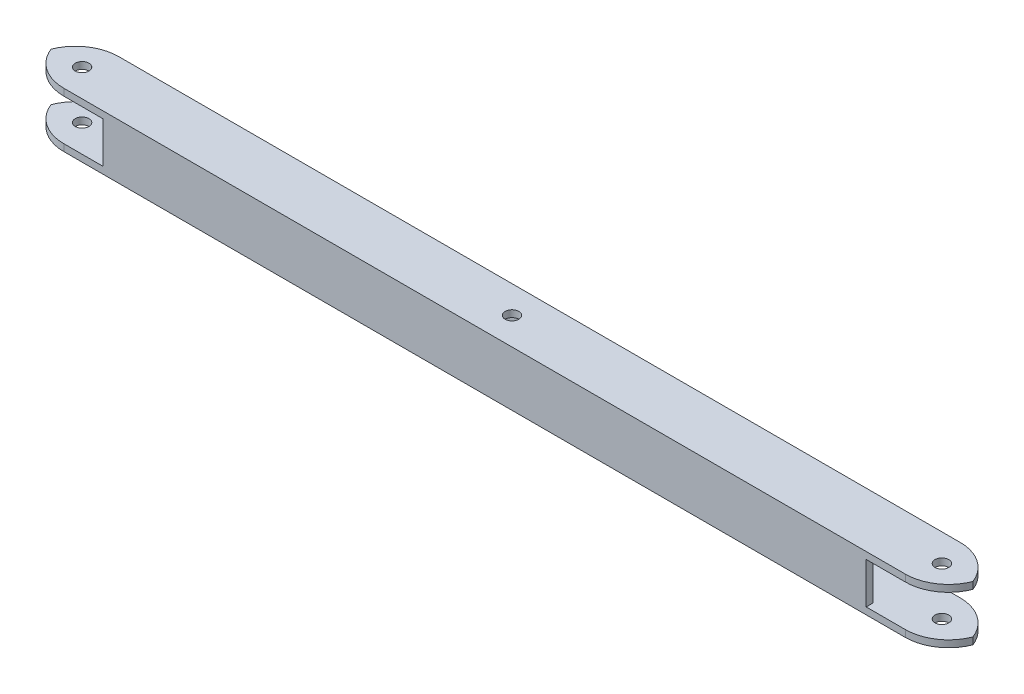
ISO-10303-21;
HEADER;
FILE_DESCRIPTION(('STEP AP214'),'2;1');
FILE_NAME('part.step','',(''),(''),'','','');
FILE_SCHEMA(('AUTOMOTIVE_DESIGN { 1 0 10303 214 1 1 1 1 }'));
ENDSEC;
DATA;
#1=APPLICATION_CONTEXT('core data for automotive mechanical design processes');
#2=APPLICATION_PROTOCOL_DEFINITION('international standard','automotive_design',2000,#1);
#3=PRODUCT_CONTEXT('',#1,'mechanical');
#4=PRODUCT('Part','Part','',(#3));
#5=PRODUCT_RELATED_PRODUCT_CATEGORY('part','',(#4));
#6=PRODUCT_DEFINITION_FORMATION('','',#4);
#7=PRODUCT_DEFINITION_CONTEXT('part definition',#1,'design');
#8=PRODUCT_DEFINITION('design','',#6,#7);
#9=PRODUCT_DEFINITION_SHAPE('','',#8);
#10=(LENGTH_UNIT() NAMED_UNIT(*) SI_UNIT(.MILLI.,.METRE.));
#11=(NAMED_UNIT(*) PLANE_ANGLE_UNIT() SI_UNIT($,.RADIAN.));
#12=(NAMED_UNIT(*) SI_UNIT($,.STERADIAN.) SOLID_ANGLE_UNIT());
#13=UNCERTAINTY_MEASURE_WITH_UNIT(LENGTH_MEASURE(1.E-05),#10,'distance_accuracy_value','');
#14=(GEOMETRIC_REPRESENTATION_CONTEXT(3) GLOBAL_UNCERTAINTY_ASSIGNED_CONTEXT((#13)) GLOBAL_UNIT_ASSIGNED_CONTEXT((#10,
#11,#12)) REPRESENTATION_CONTEXT('',''));
#15=CARTESIAN_POINT('',(0.,0.,0.));
#16=DIRECTION('',(0.,0.,1.));
#17=DIRECTION('',(1.,0.,0.));
#18=AXIS2_PLACEMENT_3D('',#15,#16,#17);
#19=CARTESIAN_POINT('',(429.48,25.4,25.4000000000002));
#20=DIRECTION('',(0.,0.,-1.));
#21=DIRECTION('',(-1.,0.,0.));
#22=AXIS2_PLACEMENT_3D('',#19,#20,#21);
#23=PLANE('',#22);
#24=DIRECTION('',(1.,0.,0.));
#25=VECTOR('',#24,1.);
#26=CARTESIAN_POINT('',(429.48,0.,25.4000000000002));
#27=LINE('',#26,#25);
#28=CARTESIAN_POINT('',(20.,0.,25.4000000000003));
#29=VERTEX_POINT('',#28);
#30=CARTESIAN_POINT('',(409.48,0.,25.4000000000002));
#31=VERTEX_POINT('',#30);
#32=EDGE_CURVE('E284',#29,#31,#27,.T.);
#33=ORIENTED_EDGE('',*,*,#32,.T.);
#34=DIRECTION('',(0.,-1.,0.));
#35=VECTOR('',#34,1.);
#36=CARTESIAN_POINT('',(409.48,25.4,25.4000000000002));
#37=LINE('',#36,#35);
#38=CARTESIAN_POINT('',(409.48,3.175,25.4000000000003));
#39=VERTEX_POINT('',#38);
#40=EDGE_CURVE('E11',#31,#39,#37,.F.);
#41=ORIENTED_EDGE('',*,*,#40,.T.);
#42=DIRECTION('',(1.,0.,0.));
#43=VECTOR('',#42,1.);
#44=CARTESIAN_POINT('',(391.38,3.175,25.4000000000003));
#45=LINE('',#44,#43);
#46=CARTESIAN_POINT('',(391.38,3.175,25.4000000000003));
#47=VERTEX_POINT('',#46);
#48=EDGE_CURVE('E188',#47,#39,#45,.T.);
#49=ORIENTED_EDGE('',*,*,#48,.F.);
#50=DIRECTION('',(0.,1.,0.));
#51=VECTOR('',#50,1.);
#52=CARTESIAN_POINT('',(391.38,22.225,25.4000000000003));
#53=LINE('',#52,#51);
#54=CARTESIAN_POINT('',(391.38,22.225,25.4000000000003));
#55=VERTEX_POINT('',#54);
#56=EDGE_CURVE('E194',#47,#55,#53,.T.);
#57=ORIENTED_EDGE('',*,*,#56,.T.);
#58=DIRECTION('',(1.,0.,0.));
#59=VECTOR('',#58,1.);
#60=CARTESIAN_POINT('',(391.38,22.225,25.4000000000003));
#61=LINE('',#60,#59);
#62=CARTESIAN_POINT('',(409.48,22.225,25.4000000000003));
#63=VERTEX_POINT('',#62);
#64=EDGE_CURVE('E176',#55,#63,#61,.T.);
#65=ORIENTED_EDGE('',*,*,#64,.T.);
#66=DIRECTION('',(0.,-1.,0.));
#67=VECTOR('',#66,1.);
#68=CARTESIAN_POINT('',(409.48,25.4,25.4000000000002));
#69=LINE('',#68,#67);
#70=CARTESIAN_POINT('',(409.48,25.4,25.4000000000002));
#71=VERTEX_POINT('',#70);
#72=EDGE_CURVE('E46',#63,#71,#69,.F.);
#73=ORIENTED_EDGE('',*,*,#72,.T.);
#74=DIRECTION('',(1.,0.,0.));
#75=VECTOR('',#74,1.);
#76=CARTESIAN_POINT('',(429.48,25.4,25.4000000000002));
#77=LINE('',#76,#75);
#78=CARTESIAN_POINT('',(20.,25.4,25.4000000000003));
#79=VERTEX_POINT('',#78);
#80=EDGE_CURVE('E287',#79,#71,#77,.T.);
#81=ORIENTED_EDGE('',*,*,#80,.F.);
#82=DIRECTION('',(0.,-1.,0.));
#83=VECTOR('',#82,1.);
#84=CARTESIAN_POINT('',(20.,25.4,25.4000000000003));
#85=LINE('',#84,#83);
#86=CARTESIAN_POINT('',(20.,22.225,25.4000000000003));
#87=VERTEX_POINT('',#86);
#88=EDGE_CURVE('E344',#79,#87,#85,.T.);
#89=ORIENTED_EDGE('',*,*,#88,.T.);
#90=DIRECTION('',(-1.,0.,0.));
#91=VECTOR('',#90,1.);
#92=CARTESIAN_POINT('',(38.1,22.225,25.4000000000003));
#93=LINE('',#92,#91);
#94=CARTESIAN_POINT('',(38.1,22.225,25.4000000000003));
#95=VERTEX_POINT('',#94);
#96=EDGE_CURVE('E232',#95,#87,#93,.T.);
#97=ORIENTED_EDGE('',*,*,#96,.F.);
#98=DIRECTION('',(0.,1.,0.));
#99=VECTOR('',#98,1.);
#100=CARTESIAN_POINT('',(38.1,22.225,25.4000000000003));
#101=LINE('',#100,#99);
#102=CARTESIAN_POINT('',(38.1,3.175,25.4000000000003));
#103=VERTEX_POINT('',#102);
#104=EDGE_CURVE('E228',#103,#95,#101,.T.);
#105=ORIENTED_EDGE('',*,*,#104,.F.);
#106=DIRECTION('',(-1.,0.,0.));
#107=VECTOR('',#106,1.);
#108=CARTESIAN_POINT('',(38.1,3.175,25.4000000000003));
#109=LINE('',#108,#107);
#110=CARTESIAN_POINT('',(20.,3.175,25.4000000000003));
#111=VERTEX_POINT('',#110);
#112=EDGE_CURVE('E236',#103,#111,#109,.T.);
#113=ORIENTED_EDGE('',*,*,#112,.T.);
#114=DIRECTION('',(0.,-1.,0.));
#115=VECTOR('',#114,1.);
#116=CARTESIAN_POINT('',(20.,25.4,25.4000000000003));
#117=LINE('',#116,#115);
#118=EDGE_CURVE('E347',#111,#29,#117,.T.);
#119=ORIENTED_EDGE('',*,*,#118,.T.);
#120=EDGE_LOOP('',(#33,#41,#49,#57,#65,#73,#81,#89,#97,#105,#113,#119));
#121=FACE_BOUND('',#120,.T.);
#122=ADVANCED_FACE('F37',(#121),#23,.F.);
#123=CARTESIAN_POINT('',(0.,25.4,0.));
#124=DIRECTION('',(0.,0.,1.));
#125=DIRECTION('',(1.,0.,0.));
#126=AXIS2_PLACEMENT_3D('',#123,#124,#125);
#127=PLANE('',#126);
#128=DIRECTION('',(1.,0.,0.));
#129=VECTOR('',#128,1.);
#130=CARTESIAN_POINT('',(391.38,3.175,0.));
#131=LINE('',#130,#129);
#132=CARTESIAN_POINT('',(391.38,3.175,0.));
#133=VERTEX_POINT('',#132);
#134=CARTESIAN_POINT('',(409.48,3.175,0.));
#135=VERTEX_POINT('',#134);
#136=EDGE_CURVE('E212',#133,#135,#131,.T.);
#137=ORIENTED_EDGE('',*,*,#136,.T.);
#138=DIRECTION('',(0.,-1.,0.));
#139=VECTOR('',#138,1.);
#140=CARTESIAN_POINT('',(409.48,25.4,0.));
#141=LINE('',#140,#139);
#142=CARTESIAN_POINT('',(409.48,0.,0.));
#143=VERTEX_POINT('',#142);
#144=EDGE_CURVE('E312',#135,#143,#141,.T.);
#145=ORIENTED_EDGE('',*,*,#144,.T.);
#146=DIRECTION('',(-1.,0.,0.));
#147=VECTOR('',#146,1.);
#148=CARTESIAN_POINT('',(0.,0.,0.));
#149=LINE('',#148,#147);
#150=CARTESIAN_POINT('',(20.,0.,0.));
#151=VERTEX_POINT('',#150);
#152=EDGE_CURVE('E290',#143,#151,#149,.T.);
#153=ORIENTED_EDGE('',*,*,#152,.T.);
#154=DIRECTION('',(0.,-1.,0.));
#155=VECTOR('',#154,1.);
#156=CARTESIAN_POINT('',(20.,25.4,0.));
#157=LINE('',#156,#155);
#158=CARTESIAN_POINT('',(20.,3.175,0.));
#159=VERTEX_POINT('',#158);
#160=EDGE_CURVE('E307',#151,#159,#157,.F.);
#161=ORIENTED_EDGE('',*,*,#160,.T.);
#162=DIRECTION('',(-1.,0.,0.));
#163=VECTOR('',#162,1.);
#164=CARTESIAN_POINT('',(38.1,3.175,0.));
#165=LINE('',#164,#163);
#166=CARTESIAN_POINT('',(38.1,3.175,0.));
#167=VERTEX_POINT('',#166);
#168=EDGE_CURVE('E239',#167,#159,#165,.T.);
#169=ORIENTED_EDGE('',*,*,#168,.F.);
#170=DIRECTION('',(0.,-1.,0.));
#171=VECTOR('',#170,1.);
#172=CARTESIAN_POINT('',(38.1,3.175,0.));
#173=LINE('',#172,#171);
#174=CARTESIAN_POINT('',(38.1,22.225,0.));
#175=VERTEX_POINT('',#174);
#176=EDGE_CURVE('E221',#175,#167,#173,.T.);
#177=ORIENTED_EDGE('',*,*,#176,.F.);
#178=DIRECTION('',(-1.,0.,0.));
#179=VECTOR('',#178,1.);
#180=CARTESIAN_POINT('',(38.1,22.225,0.));
#181=LINE('',#180,#179);
#182=CARTESIAN_POINT('',(20.,22.225,0.));
#183=VERTEX_POINT('',#182);
#184=EDGE_CURVE('E231',#175,#183,#181,.T.);
#185=ORIENTED_EDGE('',*,*,#184,.T.);
#186=DIRECTION('',(0.,-1.,0.));
#187=VECTOR('',#186,1.);
#188=CARTESIAN_POINT('',(20.,25.4,0.));
#189=LINE('',#188,#187);
#190=CARTESIAN_POINT('',(20.,25.4,0.));
#191=VERTEX_POINT('',#190);
#192=EDGE_CURVE('E305',#183,#191,#189,.F.);
#193=ORIENTED_EDGE('',*,*,#192,.T.);
#194=DIRECTION('',(-1.,0.,0.));
#195=VECTOR('',#194,1.);
#196=CARTESIAN_POINT('',(0.,25.4,0.));
#197=LINE('',#196,#195);
#198=CARTESIAN_POINT('',(409.48,25.4,0.));
#199=VERTEX_POINT('',#198);
#200=EDGE_CURVE('E289',#199,#191,#197,.T.);
#201=ORIENTED_EDGE('',*,*,#200,.F.);
#202=DIRECTION('',(0.,-1.,0.));
#203=VECTOR('',#202,1.);
#204=CARTESIAN_POINT('',(409.48,25.4,0.));
#205=LINE('',#204,#203);
#206=CARTESIAN_POINT('',(409.48,22.225,0.));
#207=VERTEX_POINT('',#206);
#208=EDGE_CURVE('E309',#199,#207,#205,.T.);
#209=ORIENTED_EDGE('',*,*,#208,.T.);
#210=DIRECTION('',(1.,0.,0.));
#211=VECTOR('',#210,1.);
#212=CARTESIAN_POINT('',(391.38,22.225,0.));
#213=LINE('',#212,#211);
#214=CARTESIAN_POINT('',(391.38,22.225,0.));
#215=VERTEX_POINT('',#214);
#216=EDGE_CURVE('E210',#215,#207,#213,.T.);
#217=ORIENTED_EDGE('',*,*,#216,.F.);
#218=DIRECTION('',(0.,-1.,0.));
#219=VECTOR('',#218,1.);
#220=CARTESIAN_POINT('',(391.38,3.175,0.));
#221=LINE('',#220,#219);
#222=EDGE_CURVE('E189',#215,#133,#221,.T.);
#223=ORIENTED_EDGE('',*,*,#222,.T.);
#224=EDGE_LOOP('',(#137,#145,#153,#161,#169,#177,#185,#193,#201,#209,#217,#223));
#225=FACE_BOUND('',#224,.T.);
#226=ADVANCED_FACE('F373',(#225),#127,.F.);
#227=CARTESIAN_POINT('',(214.74,25.4,12.7));
#228=DIRECTION('',(0.,-1.,0.));
#229=DIRECTION('',(0.,0.,-1.));
#230=AXIS2_PLACEMENT_3D('',#227,#228,#229);
#231=CYLINDRICAL_SURFACE('',#230,3.175);
#232=CARTESIAN_POINT('',(214.74,22.225,12.7));
#233=DIRECTION('',(0.,1.,0.));
#234=DIRECTION('',(0.,0.,1.));
#235=AXIS2_PLACEMENT_3D('',#232,#233,#234);
#236=CIRCLE('',#235,3.175);
#237=CARTESIAN_POINT('',(214.74,22.225,15.875));
#238=VERTEX_POINT('',#237);
#239=EDGE_CURVE('E265',#238,#238,#236,.T.);
#240=ORIENTED_EDGE('',*,*,#239,.F.);
#241=EDGE_LOOP('',(#240));
#242=FACE_BOUND('',#241,.T.);
#243=CARTESIAN_POINT('',(214.74,25.4,12.7));
#244=DIRECTION('',(0.,1.,0.));
#245=DIRECTION('',(0.,0.,1.));
#246=AXIS2_PLACEMENT_3D('',#243,#244,#245);
#247=CIRCLE('',#246,3.175);
#248=CARTESIAN_POINT('',(214.74,25.4,15.875));
#249=VERTEX_POINT('',#248);
#250=EDGE_CURVE('E281',#249,#249,#247,.T.);
#251=ORIENTED_EDGE('',*,*,#250,.T.);
#252=EDGE_LOOP('',(#251));
#253=FACE_BOUND('',#252,.T.);
#254=ADVANCED_FACE('F442',(#242,#253),#231,.F.);
#255=CARTESIAN_POINT('',(413.72,25.4,12.7));
#256=DIRECTION('',(0.,-1.,0.));
#257=DIRECTION('',(0.,0.,-1.));
#258=AXIS2_PLACEMENT_3D('',#255,#256,#257);
#259=CYLINDRICAL_SURFACE('',#258,3.17500000000009);
#260=CARTESIAN_POINT('',(413.72,22.225,12.7));
#261=DIRECTION('',(0.,1.,0.));
#262=DIRECTION('',(0.,0.,1.));
#263=AXIS2_PLACEMENT_3D('',#260,#261,#262);
#264=CIRCLE('',#263,3.17500000000009);
#265=CARTESIAN_POINT('',(413.72,22.225,15.8750000000001));
#266=VERTEX_POINT('',#265);
#267=EDGE_CURVE('E262',#266,#266,#264,.T.);
#268=ORIENTED_EDGE('',*,*,#267,.F.);
#269=EDGE_LOOP('',(#268));
#270=FACE_BOUND('',#269,.T.);
#271=CARTESIAN_POINT('',(413.72,25.4,12.7));
#272=DIRECTION('',(0.,1.,0.));
#273=DIRECTION('',(0.,0.,-1.));
#274=AXIS2_PLACEMENT_3D('',#271,#272,#273);
#275=CIRCLE('',#274,3.17500000000009);
#276=CARTESIAN_POINT('',(413.72,25.4,9.52499999999993));
#277=VERTEX_POINT('',#276);
#278=EDGE_CURVE('E275',#277,#277,#275,.T.);
#279=ORIENTED_EDGE('',*,*,#278,.T.);
#280=EDGE_LOOP('',(#279));
#281=FACE_BOUND('',#280,.T.);
#282=ADVANCED_FACE('F478',(#270,#281),#259,.F.);
#283=CARTESIAN_POINT('',(15.76,25.4,12.7000000000001));
#284=DIRECTION('',(0.,-1.,0.));
#285=DIRECTION('',(0.,0.,-1.));
#286=AXIS2_PLACEMENT_3D('',#283,#284,#285);
#287=CYLINDRICAL_SURFACE('',#286,3.17500000000001);
#288=CARTESIAN_POINT('',(15.76,22.225,12.7000000000001));
#289=DIRECTION('',(0.,1.,0.));
#290=DIRECTION('',(0.,0.,1.));
#291=AXIS2_PLACEMENT_3D('',#288,#289,#290);
#292=CIRCLE('',#291,3.17500000000001);
#293=CARTESIAN_POINT('',(15.76,22.225,15.8750000000001));
#294=VERTEX_POINT('',#293);
#295=EDGE_CURVE('E261',#294,#294,#292,.T.);
#296=ORIENTED_EDGE('',*,*,#295,.F.);
#297=EDGE_LOOP('',(#296));
#298=FACE_BOUND('',#297,.T.);
#299=CARTESIAN_POINT('',(15.76,25.4,12.7000000000001));
#300=DIRECTION('',(0.,1.,0.));
#301=DIRECTION('',(0.,0.,1.));
#302=AXIS2_PLACEMENT_3D('',#299,#300,#301);
#303=CIRCLE('',#302,3.17500000000001);
#304=CARTESIAN_POINT('',(15.76,25.4,15.8750000000001));
#305=VERTEX_POINT('',#304);
#306=EDGE_CURVE('E269',#305,#305,#303,.T.);
#307=ORIENTED_EDGE('',*,*,#306,.T.);
#308=EDGE_LOOP('',(#307));
#309=FACE_BOUND('',#308,.T.);
#310=ADVANCED_FACE('F473',(#298,#309),#287,.F.);
#311=CARTESIAN_POINT('',(0.,25.4,0.));
#312=DIRECTION('',(0.,-1.,0.));
#313=DIRECTION('',(0.,0.,-1.));
#314=AXIS2_PLACEMENT_3D('',#311,#312,#313);
#315=PLANE('',#314);
#316=CARTESIAN_POINT('',(409.48,25.4,5.40000000000018));
#317=DIRECTION('',(0.,-1.,0.));
#318=DIRECTION('',(0.,0.,-1.));
#319=AXIS2_PLACEMENT_3D('',#316,#317,#318);
#320=CIRCLE('',#319,20.);
#321=CARTESIAN_POINT('',(428.100150375333,25.4,12.7000000000001));
#322=VERTEX_POINT('',#321);
#323=EDGE_CURVE('E54',#71,#322,#320,.F.);
#324=ORIENTED_EDGE('',*,*,#323,.T.);
#325=CARTESIAN_POINT('',(409.48,25.4,20.));
#326=DIRECTION('',(0.,-1.,0.));
#327=DIRECTION('',(0.,0.,-1.));
#328=AXIS2_PLACEMENT_3D('',#325,#326,#327);
#329=CIRCLE('',#328,20.);
#330=EDGE_CURVE('E342',#322,#199,#329,.F.);
#331=ORIENTED_EDGE('',*,*,#330,.T.);
#332=ORIENTED_EDGE('',*,*,#200,.T.);
#333=CARTESIAN_POINT('',(20.,25.4,20.));
#334=DIRECTION('',(0.,-1.,0.));
#335=DIRECTION('',(0.,0.,-1.));
#336=AXIS2_PLACEMENT_3D('',#333,#334,#335);
#337=CIRCLE('',#336,20.);
#338=CARTESIAN_POINT('',(1.37984962466732,25.4,12.7000000000001));
#339=VERTEX_POINT('',#338);
#340=EDGE_CURVE('E61',#191,#339,#337,.F.);
#341=ORIENTED_EDGE('',*,*,#340,.T.);
#342=CARTESIAN_POINT('',(20.,25.4,5.40000000000028));
#343=DIRECTION('',(0.,-1.,0.));
#344=DIRECTION('',(0.,0.,-1.));
#345=AXIS2_PLACEMENT_3D('',#342,#343,#344);
#346=CIRCLE('',#345,20.);
#347=EDGE_CURVE('E339',#339,#79,#346,.F.);
#348=ORIENTED_EDGE('',*,*,#347,.T.);
#349=ORIENTED_EDGE('',*,*,#80,.T.);
#350=EDGE_LOOP('',(#324,#331,#332,#341,#348,#349));
#351=FACE_BOUND('',#350,.T.);
#352=ORIENTED_EDGE('',*,*,#250,.F.);
#353=EDGE_LOOP('',(#352));
#354=FACE_BOUND('',#353,.T.);
#355=ORIENTED_EDGE('',*,*,#278,.F.);
#356=EDGE_LOOP('',(#355));
#357=FACE_BOUND('',#356,.T.);
#358=ORIENTED_EDGE('',*,*,#306,.F.);
#359=EDGE_LOOP('',(#358));
#360=FACE_BOUND('',#359,.T.);
#361=ADVANCED_FACE('F417',(#351,#354,#357,#360),#315,.F.);
#362=CARTESIAN_POINT('',(0.,0.,0.));
#363=DIRECTION('',(0.,-1.,0.));
#364=DIRECTION('',(0.,0.,-1.));
#365=AXIS2_PLACEMENT_3D('',#362,#363,#364);
#366=PLANE('',#365);
#367=CARTESIAN_POINT('',(413.72,0.,12.7));
#368=DIRECTION('',(0.,1.,0.));
#369=DIRECTION('',(0.,0.,-1.));
#370=AXIS2_PLACEMENT_3D('',#367,#368,#369);
#371=CIRCLE('',#370,3.17500000000009);
#372=CARTESIAN_POINT('',(413.72,0.,9.52499999999993));
#373=VERTEX_POINT('',#372);
#374=EDGE_CURVE('E272',#373,#373,#371,.T.);
#375=ORIENTED_EDGE('',*,*,#374,.T.);
#376=EDGE_LOOP('',(#375));
#377=FACE_BOUND('',#376,.T.);
#378=ORIENTED_EDGE('',*,*,#152,.F.);
#379=CARTESIAN_POINT('',(409.48,0.,20.));
#380=DIRECTION('',(0.,-1.,0.));
#381=DIRECTION('',(0.,0.,-1.));
#382=AXIS2_PLACEMENT_3D('',#379,#380,#381);
#383=CIRCLE('',#382,20.);
#384=CARTESIAN_POINT('',(428.100150375333,0.,12.7000000000001));
#385=VERTEX_POINT('',#384);
#386=EDGE_CURVE('E321',#143,#385,#383,.T.);
#387=ORIENTED_EDGE('',*,*,#386,.T.);
#388=CARTESIAN_POINT('',(409.48,0.,5.40000000000018));
#389=DIRECTION('',(0.,-1.,0.));
#390=DIRECTION('',(0.,0.,-1.));
#391=AXIS2_PLACEMENT_3D('',#388,#389,#390);
#392=CIRCLE('',#391,20.);
#393=EDGE_CURVE('E319',#385,#31,#392,.T.);
#394=ORIENTED_EDGE('',*,*,#393,.T.);
#395=ORIENTED_EDGE('',*,*,#32,.F.);
#396=CARTESIAN_POINT('',(20.,0.,5.40000000000028));
#397=DIRECTION('',(0.,-1.,0.));
#398=DIRECTION('',(0.,0.,-1.));
#399=AXIS2_PLACEMENT_3D('',#396,#397,#398);
#400=CIRCLE('',#399,20.);
#401=CARTESIAN_POINT('',(1.37984962466732,0.,12.7000000000001));
#402=VERTEX_POINT('',#401);
#403=EDGE_CURVE('E317',#29,#402,#400,.T.);
#404=ORIENTED_EDGE('',*,*,#403,.T.);
#405=CARTESIAN_POINT('',(20.,0.,20.));
#406=DIRECTION('',(0.,-1.,0.));
#407=DIRECTION('',(0.,0.,-1.));
#408=AXIS2_PLACEMENT_3D('',#405,#406,#407);
#409=CIRCLE('',#408,20.);
#410=EDGE_CURVE('E315',#402,#151,#409,.T.);
#411=ORIENTED_EDGE('',*,*,#410,.T.);
#412=EDGE_LOOP('',(#378,#387,#394,#395,#404,#411));
#413=FACE_BOUND('',#412,.T.);
#414=CARTESIAN_POINT('',(214.74,0.,12.7));
#415=DIRECTION('',(0.,1.,0.));
#416=DIRECTION('',(0.,0.,1.));
#417=AXIS2_PLACEMENT_3D('',#414,#415,#416);
#418=CIRCLE('',#417,3.175);
#419=CARTESIAN_POINT('',(214.74,0.,15.875));
#420=VERTEX_POINT('',#419);
#421=EDGE_CURVE('E278',#420,#420,#418,.T.);
#422=ORIENTED_EDGE('',*,*,#421,.T.);
#423=EDGE_LOOP('',(#422));
#424=FACE_BOUND('',#423,.T.);
#425=CARTESIAN_POINT('',(15.76,0.,12.7000000000001));
#426=DIRECTION('',(0.,1.,0.));
#427=DIRECTION('',(0.,0.,1.));
#428=AXIS2_PLACEMENT_3D('',#425,#426,#427);
#429=CIRCLE('',#428,3.17500000000001);
#430=CARTESIAN_POINT('',(15.76,0.,15.8750000000001));
#431=VERTEX_POINT('',#430);
#432=EDGE_CURVE('E268',#431,#431,#429,.T.);
#433=ORIENTED_EDGE('',*,*,#432,.T.);
#434=EDGE_LOOP('',(#433));
#435=FACE_BOUND('',#434,.T.);
#436=ADVANCED_FACE('F399',(#377,#413,#424,#435),#366,.T.);
#437=CARTESIAN_POINT('',(214.74,3.175,12.7));
#438=DIRECTION('',(0.,-1.,0.));
#439=DIRECTION('',(0.,0.,-1.));
#440=AXIS2_PLACEMENT_3D('',#437,#438,#439);
#441=CIRCLE('',#440,3.175);
#442=CARTESIAN_POINT('',(214.74,3.175,9.525));
#443=VERTEX_POINT('',#442);
#444=EDGE_CURVE('E258',#443,#443,#441,.T.);
#445=ORIENTED_EDGE('',*,*,#444,.F.);
#446=EDGE_LOOP('',(#445));
#447=FACE_BOUND('',#446,.T.);
#448=ORIENTED_EDGE('',*,*,#421,.F.);
#449=EDGE_LOOP('',(#448));
#450=FACE_BOUND('',#449,.T.);
#451=ADVANCED_FACE('F476',(#447,#450),#231,.F.);
#452=CARTESIAN_POINT('',(413.72,3.175,12.7));
#453=DIRECTION('',(0.,-1.,0.));
#454=DIRECTION('',(0.,0.,-1.));
#455=AXIS2_PLACEMENT_3D('',#452,#453,#454);
#456=CIRCLE('',#455,3.17500000000009);
#457=CARTESIAN_POINT('',(413.72,3.175,9.52499999999993));
#458=VERTEX_POINT('',#457);
#459=EDGE_CURVE('E255',#458,#458,#456,.T.);
#460=ORIENTED_EDGE('',*,*,#459,.F.);
#461=EDGE_LOOP('',(#460));
#462=FACE_BOUND('',#461,.T.);
#463=ORIENTED_EDGE('',*,*,#374,.F.);
#464=EDGE_LOOP('',(#463));
#465=FACE_BOUND('',#464,.T.);
#466=ADVANCED_FACE('F471',(#462,#465),#259,.F.);
#467=CARTESIAN_POINT('',(15.76,3.175,12.7000000000001));
#468=DIRECTION('',(0.,-1.,0.));
#469=DIRECTION('',(0.,0.,-1.));
#470=AXIS2_PLACEMENT_3D('',#467,#468,#469);
#471=CIRCLE('',#470,3.17500000000001);
#472=CARTESIAN_POINT('',(15.76,3.175,9.52500000000006));
#473=VERTEX_POINT('',#472);
#474=EDGE_CURVE('E249',#473,#473,#471,.T.);
#475=ORIENTED_EDGE('',*,*,#474,.F.);
#476=EDGE_LOOP('',(#475));
#477=FACE_BOUND('',#476,.T.);
#478=ORIENTED_EDGE('',*,*,#432,.F.);
#479=EDGE_LOOP('',(#478));
#480=FACE_BOUND('',#479,.T.);
#481=ADVANCED_FACE('F467',(#477,#480),#287,.F.);
#482=CARTESIAN_POINT('',(456.420768363208,22.225,22.2250000000003));
#483=DIRECTION('',(0.,1.,0.));
#484=DIRECTION('',(0.,0.,1.));
#485=AXIS2_PLACEMENT_3D('',#482,#483,#484);
#486=PLANE('',#485);
#487=ORIENTED_EDGE('',*,*,#239,.T.);
#488=EDGE_LOOP('',(#487));
#489=FACE_BOUND('',#488,.T.);
#490=ORIENTED_EDGE('',*,*,#216,.T.);
#491=CARTESIAN_POINT('',(409.48,22.225,20.));
#492=DIRECTION('',(0.,1.,0.));
#493=DIRECTION('',(0.,0.,1.));
#494=AXIS2_PLACEMENT_3D('',#491,#492,#493);
#495=CIRCLE('',#494,20.);
#496=CARTESIAN_POINT('',(428.100150375333,22.225,12.7000000000001));
#497=VERTEX_POINT('',#496);
#498=EDGE_CURVE('E336',#207,#497,#495,.F.);
#499=ORIENTED_EDGE('',*,*,#498,.T.);
#500=CARTESIAN_POINT('',(409.48,22.225,5.40000000000018));
#501=DIRECTION('',(0.,1.,0.));
#502=DIRECTION('',(0.,0.,1.));
#503=AXIS2_PLACEMENT_3D('',#500,#501,#502);
#504=CIRCLE('',#503,20.);
#505=EDGE_CURVE('E184',#497,#63,#504,.F.);
#506=ORIENTED_EDGE('',*,*,#505,.T.);
#507=ORIENTED_EDGE('',*,*,#64,.F.);
#508=DIRECTION('',(0.,0.,-1.));
#509=VECTOR('',#508,1.);
#510=CARTESIAN_POINT('',(391.38,22.225,0.));
#511=LINE('',#510,#509);
#512=CARTESIAN_POINT('',(391.38,22.225,22.2250000000003));
#513=VERTEX_POINT('',#512);
#514=EDGE_CURVE('E181',#55,#513,#511,.T.);
#515=ORIENTED_EDGE('',*,*,#514,.T.);
#516=DIRECTION('',(-1.,0.,0.));
#517=VECTOR('',#516,1.);
#518=CARTESIAN_POINT('',(456.420768363208,22.225,22.2250000000003));
#519=LINE('',#518,#517);
#520=CARTESIAN_POINT('',(38.1,22.225,22.2250000000003));
#521=VERTEX_POINT('',#520);
#522=EDGE_CURVE('E247',#513,#521,#519,.T.);
#523=ORIENTED_EDGE('',*,*,#522,.T.);
#524=DIRECTION('',(0.,0.,-1.));
#525=VECTOR('',#524,1.);
#526=CARTESIAN_POINT('',(38.1,22.225,0.));
#527=LINE('',#526,#525);
#528=EDGE_CURVE('E218',#95,#521,#527,.T.);
#529=ORIENTED_EDGE('',*,*,#528,.F.);
#530=ORIENTED_EDGE('',*,*,#96,.T.);
#531=CARTESIAN_POINT('',(20.,22.225,5.40000000000028));
#532=DIRECTION('',(0.,1.,0.));
#533=DIRECTION('',(0.,0.,1.));
#534=AXIS2_PLACEMENT_3D('',#531,#532,#533);
#535=CIRCLE('',#534,20.);
#536=CARTESIAN_POINT('',(1.37984962466732,22.225,12.7000000000001));
#537=VERTEX_POINT('',#536);
#538=EDGE_CURVE('E333',#87,#537,#535,.F.);
#539=ORIENTED_EDGE('',*,*,#538,.T.);
#540=CARTESIAN_POINT('',(20.,22.225,20.));
#541=DIRECTION('',(0.,1.,0.));
#542=DIRECTION('',(0.,0.,1.));
#543=AXIS2_PLACEMENT_3D('',#540,#541,#542);
#544=CIRCLE('',#543,20.);
#545=EDGE_CURVE('E331',#537,#183,#544,.F.);
#546=ORIENTED_EDGE('',*,*,#545,.T.);
#547=ORIENTED_EDGE('',*,*,#184,.F.);
#548=CARTESIAN_POINT('',(38.1,22.225,3.175));
#549=VERTEX_POINT('',#548);
#550=EDGE_CURVE('E217',#549,#175,#527,.T.);
#551=ORIENTED_EDGE('',*,*,#550,.F.);
#552=DIRECTION('',(-1.,0.,0.));
#553=VECTOR('',#552,1.);
#554=CARTESIAN_POINT('',(456.420768363208,22.225,3.175));
#555=LINE('',#554,#553);
#556=CARTESIAN_POINT('',(391.38,22.225,3.175));
#557=VERTEX_POINT('',#556);
#558=EDGE_CURVE('E246',#557,#549,#555,.T.);
#559=ORIENTED_EDGE('',*,*,#558,.F.);
#560=EDGE_CURVE('E198',#557,#215,#511,.T.);
#561=ORIENTED_EDGE('',*,*,#560,.T.);
#562=EDGE_LOOP('',(#490,#499,#506,#507,#515,#523,#529,#530,#539,#546,#547,#551,#559,#561));
#563=FACE_BOUND('',#562,.T.);
#564=ORIENTED_EDGE('',*,*,#295,.T.);
#565=EDGE_LOOP('',(#564));
#566=FACE_BOUND('',#565,.T.);
#567=ORIENTED_EDGE('',*,*,#267,.T.);
#568=EDGE_LOOP('',(#567));
#569=FACE_BOUND('',#568,.T.);
#570=ADVANCED_FACE('F179',(#489,#563,#566,#569),#486,.F.);
#571=CARTESIAN_POINT('',(456.420768363208,3.175,22.2250000000003));
#572=DIRECTION('',(0.,0.,1.));
#573=DIRECTION('',(1.,0.,0.));
#574=AXIS2_PLACEMENT_3D('',#571,#572,#573);
#575=PLANE('',#574);
#576=ORIENTED_EDGE('',*,*,#522,.F.);
#577=DIRECTION('',(0.,-1.,0.));
#578=VECTOR('',#577,1.);
#579=CARTESIAN_POINT('',(391.38,3.175,22.2250000000003));
#580=LINE('',#579,#578);
#581=CARTESIAN_POINT('',(391.38,3.175,22.2250000000003));
#582=VERTEX_POINT('',#581);
#583=EDGE_CURVE('E197',#513,#582,#580,.T.);
#584=ORIENTED_EDGE('',*,*,#583,.T.);
#585=DIRECTION('',(-1.,0.,0.));
#586=VECTOR('',#585,1.);
#587=CARTESIAN_POINT('',(456.420768363208,3.175,22.2250000000003));
#588=LINE('',#587,#586);
#589=CARTESIAN_POINT('',(38.1,3.175,22.2250000000003));
#590=VERTEX_POINT('',#589);
#591=EDGE_CURVE('E250',#582,#590,#588,.T.);
#592=ORIENTED_EDGE('',*,*,#591,.T.);
#593=DIRECTION('',(0.,1.,0.));
#594=VECTOR('',#593,1.);
#595=CARTESIAN_POINT('',(38.1,3.175,22.2250000000003));
#596=LINE('',#595,#594);
#597=EDGE_CURVE('E235',#590,#521,#596,.T.);
#598=ORIENTED_EDGE('',*,*,#597,.T.);
#599=EDGE_LOOP('',(#576,#584,#592,#598));
#600=FACE_BOUND('',#599,.T.);
#601=ADVANCED_FACE('F409',(#600),#575,.F.);
#602=CARTESIAN_POINT('',(456.420768363208,3.175,3.175));
#603=DIRECTION('',(0.,-1.,0.));
#604=DIRECTION('',(0.,0.,-1.));
#605=AXIS2_PLACEMENT_3D('',#602,#603,#604);
#606=PLANE('',#605);
#607=ORIENTED_EDGE('',*,*,#444,.T.);
#608=EDGE_LOOP('',(#607));
#609=FACE_BOUND('',#608,.T.);
#610=CARTESIAN_POINT('',(409.48,3.175,5.40000000000018));
#611=DIRECTION('',(0.,-1.,0.));
#612=DIRECTION('',(0.,0.,-1.));
#613=AXIS2_PLACEMENT_3D('',#610,#611,#612);
#614=CIRCLE('',#613,20.);
#615=CARTESIAN_POINT('',(428.100150375333,3.175,12.7000000000001));
#616=VERTEX_POINT('',#615);
#617=EDGE_CURVE('E327',#39,#616,#614,.F.);
#618=ORIENTED_EDGE('',*,*,#617,.T.);
#619=CARTESIAN_POINT('',(409.48,3.175,20.));
#620=DIRECTION('',(0.,-1.,0.));
#621=DIRECTION('',(0.,0.,-1.));
#622=AXIS2_PLACEMENT_3D('',#619,#620,#621);
#623=CIRCLE('',#622,20.);
#624=EDGE_CURVE('E329',#616,#135,#623,.F.);
#625=ORIENTED_EDGE('',*,*,#624,.T.);
#626=ORIENTED_EDGE('',*,*,#136,.F.);
#627=DIRECTION('',(0.,0.,1.));
#628=VECTOR('',#627,1.);
#629=CARTESIAN_POINT('',(391.38,3.175,25.4000000000003));
#630=LINE('',#629,#628);
#631=CARTESIAN_POINT('',(391.38,3.175,3.175));
#632=VERTEX_POINT('',#631);
#633=EDGE_CURVE('E204',#133,#632,#630,.T.);
#634=ORIENTED_EDGE('',*,*,#633,.T.);
#635=DIRECTION('',(-1.,0.,0.));
#636=VECTOR('',#635,1.);
#637=CARTESIAN_POINT('',(456.420768363208,3.175,3.175));
#638=LINE('',#637,#636);
#639=CARTESIAN_POINT('',(38.1,3.175,3.175));
#640=VERTEX_POINT('',#639);
#641=EDGE_CURVE('E252',#632,#640,#638,.T.);
#642=ORIENTED_EDGE('',*,*,#641,.T.);
#643=DIRECTION('',(0.,0.,1.));
#644=VECTOR('',#643,1.);
#645=CARTESIAN_POINT('',(38.1,3.175,25.4000000000003));
#646=LINE('',#645,#644);
#647=EDGE_CURVE('E225',#167,#640,#646,.T.);
#648=ORIENTED_EDGE('',*,*,#647,.F.);
#649=ORIENTED_EDGE('',*,*,#168,.T.);
#650=CARTESIAN_POINT('',(20.,3.175,20.));
#651=DIRECTION('',(0.,-1.,0.));
#652=DIRECTION('',(0.,0.,-1.));
#653=AXIS2_PLACEMENT_3D('',#650,#651,#652);
#654=CIRCLE('',#653,20.);
#655=CARTESIAN_POINT('',(1.37984962466732,3.175,12.7000000000001));
#656=VERTEX_POINT('',#655);
#657=EDGE_CURVE('E323',#159,#656,#654,.F.);
#658=ORIENTED_EDGE('',*,*,#657,.T.);
#659=CARTESIAN_POINT('',(20.,3.175,5.40000000000028));
#660=DIRECTION('',(0.,-1.,0.));
#661=DIRECTION('',(0.,0.,-1.));
#662=AXIS2_PLACEMENT_3D('',#659,#660,#661);
#663=CIRCLE('',#662,20.);
#664=EDGE_CURVE('E325',#656,#111,#663,.F.);
#665=ORIENTED_EDGE('',*,*,#664,.T.);
#666=ORIENTED_EDGE('',*,*,#112,.F.);
#667=EDGE_CURVE('E224',#590,#103,#646,.T.);
#668=ORIENTED_EDGE('',*,*,#667,.F.);
#669=ORIENTED_EDGE('',*,*,#591,.F.);
#670=EDGE_CURVE('E202',#582,#47,#630,.T.);
#671=ORIENTED_EDGE('',*,*,#670,.T.);
#672=ORIENTED_EDGE('',*,*,#48,.T.);
#673=EDGE_LOOP('',(#618,#625,#626,#634,#642,#648,#649,#658,#665,#666,#668,#669,#671,#672));
#674=FACE_BOUND('',#673,.T.);
#675=ORIENTED_EDGE('',*,*,#474,.T.);
#676=EDGE_LOOP('',(#675));
#677=FACE_BOUND('',#676,.T.);
#678=ORIENTED_EDGE('',*,*,#459,.T.);
#679=EDGE_LOOP('',(#678));
#680=FACE_BOUND('',#679,.T.);
#681=ADVANCED_FACE('F388',(#609,#674,#677,#680),#606,.F.);
#682=CARTESIAN_POINT('',(456.420768363208,22.225,3.175));
#683=DIRECTION('',(0.,0.,-1.));
#684=DIRECTION('',(-1.,0.,0.));
#685=AXIS2_PLACEMENT_3D('',#682,#683,#684);
#686=PLANE('',#685);
#687=ORIENTED_EDGE('',*,*,#641,.F.);
#688=DIRECTION('',(0.,1.,0.));
#689=VECTOR('',#688,1.);
#690=CARTESIAN_POINT('',(391.38,22.225,3.175));
#691=LINE('',#690,#689);
#692=EDGE_CURVE('E302',#632,#557,#691,.T.);
#693=ORIENTED_EDGE('',*,*,#692,.T.);
#694=ORIENTED_EDGE('',*,*,#558,.T.);
#695=DIRECTION('',(0.,-1.,0.));
#696=VECTOR('',#695,1.);
#697=CARTESIAN_POINT('',(38.1,22.225,3.175));
#698=LINE('',#697,#696);
#699=EDGE_CURVE('E292',#549,#640,#698,.T.);
#700=ORIENTED_EDGE('',*,*,#699,.T.);
#701=EDGE_LOOP('',(#687,#693,#694,#700));
#702=FACE_BOUND('',#701,.T.);
#703=ADVANCED_FACE('F383',(#702),#686,.F.);
#704=CARTESIAN_POINT('',(38.1,0.,0.));
#705=DIRECTION('',(1.,0.,0.));
#706=DIRECTION('',(0.,0.,-1.));
#707=AXIS2_PLACEMENT_3D('',#704,#705,#706);
#708=PLANE('',#707);
#709=ORIENTED_EDGE('',*,*,#550,.T.);
#710=ORIENTED_EDGE('',*,*,#176,.T.);
#711=ORIENTED_EDGE('',*,*,#647,.T.);
#712=ORIENTED_EDGE('',*,*,#699,.F.);
#713=EDGE_LOOP('',(#709,#710,#711,#712));
#714=FACE_BOUND('',#713,.T.);
#715=ADVANCED_FACE('F377',(#714),#708,.F.);
#716=ORIENTED_EDGE('',*,*,#667,.T.);
#717=ORIENTED_EDGE('',*,*,#104,.T.);
#718=ORIENTED_EDGE('',*,*,#528,.T.);
#719=ORIENTED_EDGE('',*,*,#597,.F.);
#720=EDGE_LOOP('',(#716,#717,#718,#719));
#721=FACE_BOUND('',#720,.T.);
#722=ADVANCED_FACE('F412',(#721),#708,.F.);
#723=CARTESIAN_POINT('',(391.38,0.,0.));
#724=DIRECTION('',(-1.,0.,0.));
#725=DIRECTION('',(0.,0.,-1.));
#726=AXIS2_PLACEMENT_3D('',#723,#724,#725);
#727=PLANE('',#726);
#728=ORIENTED_EDGE('',*,*,#633,.F.);
#729=ORIENTED_EDGE('',*,*,#222,.F.);
#730=ORIENTED_EDGE('',*,*,#560,.F.);
#731=ORIENTED_EDGE('',*,*,#692,.F.);
#732=EDGE_LOOP('',(#728,#729,#730,#731));
#733=FACE_BOUND('',#732,.T.);
#734=ADVANCED_FACE('F386',(#733),#727,.F.);
#735=ORIENTED_EDGE('',*,*,#514,.F.);
#736=ORIENTED_EDGE('',*,*,#56,.F.);
#737=ORIENTED_EDGE('',*,*,#670,.F.);
#738=ORIENTED_EDGE('',*,*,#583,.F.);
#739=EDGE_LOOP('',(#735,#736,#737,#738));
#740=FACE_BOUND('',#739,.T.);
#741=ADVANCED_FACE('F193',(#740),#727,.F.);
#742=CARTESIAN_POINT('',(409.48,25.4,5.40000000000018));
#743=DIRECTION('',(0.,-1.,0.));
#744=DIRECTION('',(0.,0.,-1.));
#745=AXIS2_PLACEMENT_3D('',#742,#743,#744);
#746=CYLINDRICAL_SURFACE('',#745,20.);
#747=DIRECTION('',(0.,-1.,0.));
#748=VECTOR('',#747,1.);
#749=CARTESIAN_POINT('',(428.100150375333,1.5875,12.7000000000001));
#750=LINE('',#749,#748);
#751=EDGE_CURVE('E351',#616,#385,#750,.T.);
#752=ORIENTED_EDGE('',*,*,#751,.F.);
#753=ORIENTED_EDGE('',*,*,#617,.F.);
#754=ORIENTED_EDGE('',*,*,#40,.F.);
#755=ORIENTED_EDGE('',*,*,#393,.F.);
#756=EDGE_LOOP('',(#752,#753,#754,#755));
#757=FACE_BOUND('',#756,.T.);
#758=ADVANCED_FACE('F404',(#757),#746,.T.);
#759=CARTESIAN_POINT('',(409.48,25.4,20.));
#760=DIRECTION('',(0.,-1.,0.));
#761=DIRECTION('',(0.,0.,-1.));
#762=AXIS2_PLACEMENT_3D('',#759,#760,#761);
#763=CYLINDRICAL_SURFACE('',#762,20.);
#764=ORIENTED_EDGE('',*,*,#624,.F.);
#765=ORIENTED_EDGE('',*,*,#751,.T.);
#766=ORIENTED_EDGE('',*,*,#386,.F.);
#767=ORIENTED_EDGE('',*,*,#144,.F.);
#768=EDGE_LOOP('',(#764,#765,#766,#767));
#769=FACE_BOUND('',#768,.T.);
#770=ADVANCED_FACE('F395',(#769),#763,.T.);
#771=CARTESIAN_POINT('',(409.48,25.4,5.40000000000018));
#772=DIRECTION('',(0.,-1.,0.));
#773=DIRECTION('',(0.,0.,-1.));
#774=AXIS2_PLACEMENT_3D('',#771,#772,#773);
#775=CYLINDRICAL_SURFACE('',#774,20.);
#776=DIRECTION('',(0.,-1.,0.));
#777=VECTOR('',#776,1.);
#778=CARTESIAN_POINT('',(428.100150375333,23.8125,12.7000000000001));
#779=LINE('',#778,#777);
#780=EDGE_CURVE('E354',#322,#497,#779,.T.);
#781=ORIENTED_EDGE('',*,*,#780,.F.);
#782=ORIENTED_EDGE('',*,*,#323,.F.);
#783=ORIENTED_EDGE('',*,*,#72,.F.);
#784=ORIENTED_EDGE('',*,*,#505,.F.);
#785=EDGE_LOOP('',(#781,#782,#783,#784));
#786=FACE_BOUND('',#785,.T.);
#787=ADVANCED_FACE('F420',(#786),#775,.T.);
#788=CARTESIAN_POINT('',(409.48,25.4,20.));
#789=DIRECTION('',(0.,-1.,0.));
#790=DIRECTION('',(0.,0.,-1.));
#791=AXIS2_PLACEMENT_3D('',#788,#789,#790);
#792=CYLINDRICAL_SURFACE('',#791,20.);
#793=ORIENTED_EDGE('',*,*,#330,.F.);
#794=ORIENTED_EDGE('',*,*,#780,.T.);
#795=ORIENTED_EDGE('',*,*,#498,.F.);
#796=ORIENTED_EDGE('',*,*,#208,.F.);
#797=EDGE_LOOP('',(#793,#794,#795,#796));
#798=FACE_BOUND('',#797,.T.);
#799=ADVANCED_FACE('F424',(#798),#792,.T.);
#800=CARTESIAN_POINT('',(20.,25.4,20.));
#801=DIRECTION('',(0.,-1.,0.));
#802=DIRECTION('',(0.,0.,-1.));
#803=AXIS2_PLACEMENT_3D('',#800,#801,#802);
#804=CYLINDRICAL_SURFACE('',#803,20.);
#805=DIRECTION('',(0.,-1.,0.));
#806=VECTOR('',#805,1.);
#807=CARTESIAN_POINT('',(1.37984962466732,1.5875,12.7000000000001));
#808=LINE('',#807,#806);
#809=EDGE_CURVE('E356',#656,#402,#808,.T.);
#810=ORIENTED_EDGE('',*,*,#809,.F.);
#811=ORIENTED_EDGE('',*,*,#657,.F.);
#812=ORIENTED_EDGE('',*,*,#160,.F.);
#813=ORIENTED_EDGE('',*,*,#410,.F.);
#814=EDGE_LOOP('',(#810,#811,#812,#813));
#815=FACE_BOUND('',#814,.T.);
#816=ADVANCED_FACE('F426',(#815),#804,.T.);
#817=CARTESIAN_POINT('',(20.,25.4,5.40000000000028));
#818=DIRECTION('',(0.,-1.,0.));
#819=DIRECTION('',(0.,0.,-1.));
#820=AXIS2_PLACEMENT_3D('',#817,#818,#819);
#821=CYLINDRICAL_SURFACE('',#820,20.);
#822=ORIENTED_EDGE('',*,*,#664,.F.);
#823=ORIENTED_EDGE('',*,*,#809,.T.);
#824=ORIENTED_EDGE('',*,*,#403,.F.);
#825=ORIENTED_EDGE('',*,*,#118,.F.);
#826=EDGE_LOOP('',(#822,#823,#824,#825));
#827=FACE_BOUND('',#826,.T.);
#828=ADVANCED_FACE('F432',(#827),#821,.T.);
#829=CARTESIAN_POINT('',(20.,25.4,20.));
#830=DIRECTION('',(0.,-1.,0.));
#831=DIRECTION('',(0.,0.,-1.));
#832=AXIS2_PLACEMENT_3D('',#829,#830,#831);
#833=CYLINDRICAL_SURFACE('',#832,20.);
#834=DIRECTION('',(0.,-1.,0.));
#835=VECTOR('',#834,1.);
#836=CARTESIAN_POINT('',(1.37984962466732,23.8125,12.7000000000001));
#837=LINE('',#836,#835);
#838=EDGE_CURVE('E41',#339,#537,#837,.T.);
#839=ORIENTED_EDGE('',*,*,#838,.F.);
#840=ORIENTED_EDGE('',*,*,#340,.F.);
#841=ORIENTED_EDGE('',*,*,#192,.F.);
#842=ORIENTED_EDGE('',*,*,#545,.F.);
#843=EDGE_LOOP('',(#839,#840,#841,#842));
#844=FACE_BOUND('',#843,.T.);
#845=ADVANCED_FACE('F39',(#844),#833,.T.);
#846=CARTESIAN_POINT('',(20.,25.4,5.40000000000028));
#847=DIRECTION('',(0.,-1.,0.));
#848=DIRECTION('',(0.,0.,-1.));
#849=AXIS2_PLACEMENT_3D('',#846,#847,#848);
#850=CYLINDRICAL_SURFACE('',#849,20.);
#851=ORIENTED_EDGE('',*,*,#347,.F.);
#852=ORIENTED_EDGE('',*,*,#838,.T.);
#853=ORIENTED_EDGE('',*,*,#538,.F.);
#854=ORIENTED_EDGE('',*,*,#88,.F.);
#855=EDGE_LOOP('',(#851,#852,#853,#854));
#856=FACE_BOUND('',#855,.T.);
#857=ADVANCED_FACE('F364',(#856),#850,.T.);
#858=CLOSED_SHELL('',(#122,#226,#254,#282,#310,#361,#436,#451,#466,#481,#570,#601,#681,#703,
#715,#722,#734,#741,#758,#770,#787,#799,#816,#828,#845,#857));
#859=MANIFOLD_SOLID_BREP('B2',#858);
#860=ADVANCED_BREP_SHAPE_REPRESENTATION('',(#18,#859),#14);
#861=SHAPE_DEFINITION_REPRESENTATION(#9,#860);
ENDSEC;
END-ISO-10303-21;
